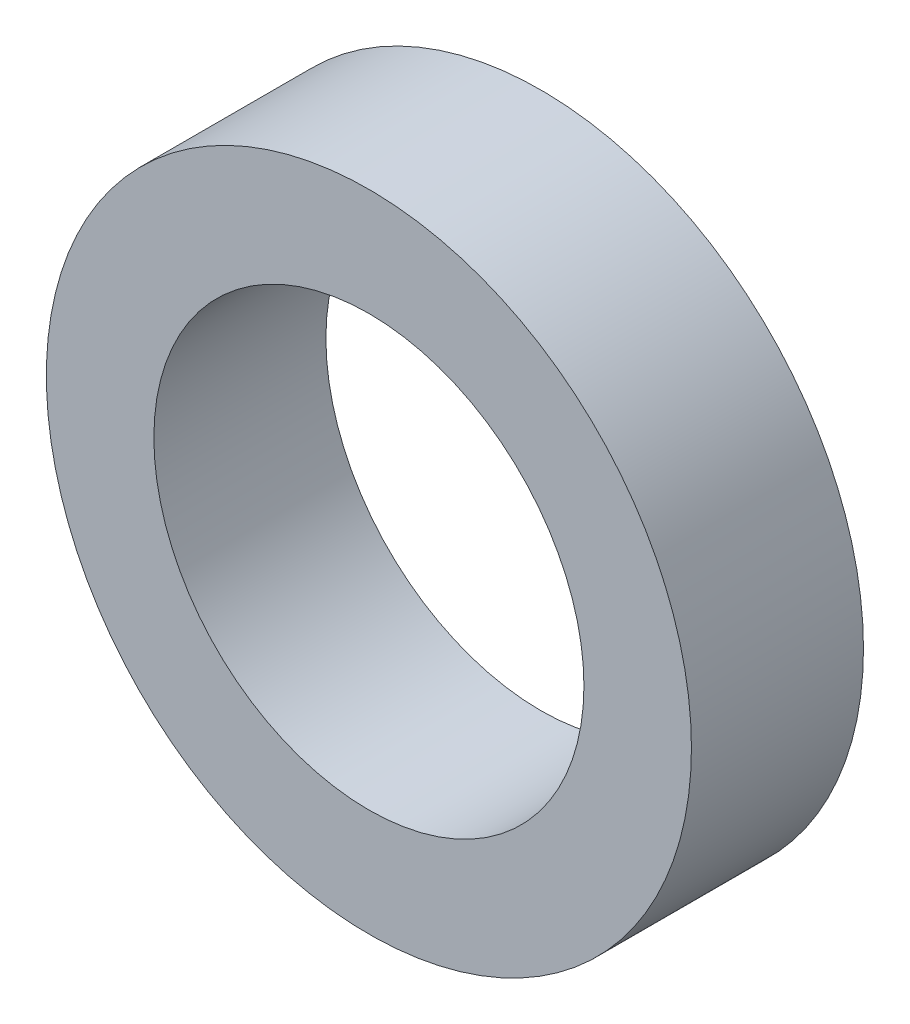
ISO-10303-21;
HEADER;
FILE_DESCRIPTION(('STEP AP214'),'2;1');
FILE_NAME('part.step','',(''),(''),'','','');
FILE_SCHEMA(('AUTOMOTIVE_DESIGN { 1 0 10303 214 1 1 1 1 }'));
ENDSEC;
DATA;
#1=APPLICATION_CONTEXT('core data for automotive mechanical design processes');
#2=APPLICATION_PROTOCOL_DEFINITION('international standard','automotive_design',2000,#1);
#3=PRODUCT_CONTEXT('',#1,'mechanical');
#4=PRODUCT('Part','Part','',(#3));
#5=PRODUCT_RELATED_PRODUCT_CATEGORY('part','',(#4));
#6=PRODUCT_DEFINITION_FORMATION('','',#4);
#7=PRODUCT_DEFINITION_CONTEXT('part definition',#1,'design');
#8=PRODUCT_DEFINITION('design','',#6,#7);
#9=PRODUCT_DEFINITION_SHAPE('','',#8);
#10=(LENGTH_UNIT() NAMED_UNIT(*) SI_UNIT(.MILLI.,.METRE.));
#11=(NAMED_UNIT(*) PLANE_ANGLE_UNIT() SI_UNIT($,.RADIAN.));
#12=(NAMED_UNIT(*) SI_UNIT($,.STERADIAN.) SOLID_ANGLE_UNIT());
#13=UNCERTAINTY_MEASURE_WITH_UNIT(LENGTH_MEASURE(1.E-05),#10,'distance_accuracy_value','');
#14=(GEOMETRIC_REPRESENTATION_CONTEXT(3) GLOBAL_UNCERTAINTY_ASSIGNED_CONTEXT((#13)) GLOBAL_UNIT_ASSIGNED_CONTEXT((#10,
#11,#12)) REPRESENTATION_CONTEXT('',''));
#15=CARTESIAN_POINT('',(0.,0.,0.));
#16=DIRECTION('',(0.,0.,1.));
#17=DIRECTION('',(1.,0.,0.));
#18=AXIS2_PLACEMENT_3D('',#15,#16,#17);
#19=CARTESIAN_POINT('',(0.,7.5,-2.));
#20=DIRECTION('',(0.,0.,1.));
#21=DIRECTION('',(1.,0.,0.));
#22=AXIS2_PLACEMENT_3D('',#19,#20,#21);
#23=PLANE('',#22);
#24=CARTESIAN_POINT('',(0.,0.,-2.));
#25=DIRECTION('',(0.,0.,1.));
#26=DIRECTION('',(1.,0.,0.));
#27=AXIS2_PLACEMENT_3D('',#24,#25,#26);
#28=CIRCLE('',#27,7.5);
#29=CARTESIAN_POINT('',(7.5,0.,-2.));
#30=VERTEX_POINT('',#29);
#31=EDGE_CURVE('E10',#30,#30,#28,.T.);
#32=ORIENTED_EDGE('',*,*,#31,.F.);
#33=EDGE_LOOP('',(#32));
#34=FACE_BOUND('',#33,.T.);
#35=CARTESIAN_POINT('',(0.,0.,-2.));
#36=DIRECTION('',(0.,0.,1.));
#37=DIRECTION('',(1.,0.,0.));
#38=AXIS2_PLACEMENT_3D('',#35,#36,#37);
#39=CIRCLE('',#38,5.);
#40=CARTESIAN_POINT('',(5.,0.,-2.));
#41=VERTEX_POINT('',#40);
#42=EDGE_CURVE('E44',#41,#41,#39,.T.);
#43=ORIENTED_EDGE('',*,*,#42,.T.);
#44=EDGE_LOOP('',(#43));
#45=FACE_BOUND('',#44,.T.);
#46=ADVANCED_FACE('F30',(#34,#45),#23,.F.);
#47=CARTESIAN_POINT('',(0.,0.,12.9347826086957));
#48=DIRECTION('',(0.,0.,1.));
#49=DIRECTION('',(1.,0.,0.));
#50=AXIS2_PLACEMENT_3D('',#47,#48,#49);
#51=CYLINDRICAL_SURFACE('',#50,7.5);
#52=CARTESIAN_POINT('',(0.,0.,2.));
#53=DIRECTION('',(0.,0.,1.));
#54=DIRECTION('',(1.,0.,0.));
#55=AXIS2_PLACEMENT_3D('',#52,#53,#54);
#56=CIRCLE('',#55,7.5);
#57=CARTESIAN_POINT('',(7.5,0.,2.));
#58=VERTEX_POINT('',#57);
#59=EDGE_CURVE('E36',#58,#58,#56,.T.);
#60=ORIENTED_EDGE('',*,*,#59,.F.);
#61=EDGE_LOOP('',(#60));
#62=FACE_BOUND('',#61,.T.);
#63=ORIENTED_EDGE('',*,*,#31,.T.);
#64=EDGE_LOOP('',(#63));
#65=FACE_BOUND('',#64,.T.);
#66=ADVANCED_FACE('F59',(#62,#65),#51,.T.);
#67=CARTESIAN_POINT('',(0.,7.5,2.));
#68=DIRECTION('',(0.,0.,-1.));
#69=DIRECTION('',(-1.,0.,0.));
#70=AXIS2_PLACEMENT_3D('',#67,#68,#69);
#71=PLANE('',#70);
#72=CARTESIAN_POINT('',(0.,0.,2.));
#73=DIRECTION('',(0.,0.,1.));
#74=DIRECTION('',(1.,0.,0.));
#75=AXIS2_PLACEMENT_3D('',#72,#73,#74);
#76=CIRCLE('',#75,5.);
#77=CARTESIAN_POINT('',(5.,0.,2.));
#78=VERTEX_POINT('',#77);
#79=EDGE_CURVE('E40',#78,#78,#76,.T.);
#80=ORIENTED_EDGE('',*,*,#79,.F.);
#81=EDGE_LOOP('',(#80));
#82=FACE_BOUND('',#81,.T.);
#83=ORIENTED_EDGE('',*,*,#59,.T.);
#84=EDGE_LOOP('',(#83));
#85=FACE_BOUND('',#84,.T.);
#86=ADVANCED_FACE('F54',(#82,#85),#71,.F.);
#87=CARTESIAN_POINT('',(0.,0.,12.9347826086957));
#88=DIRECTION('',(0.,0.,1.));
#89=DIRECTION('',(1.,0.,0.));
#90=AXIS2_PLACEMENT_3D('',#87,#88,#89);
#91=CYLINDRICAL_SURFACE('',#90,5.);
#92=ORIENTED_EDGE('',*,*,#42,.F.);
#93=EDGE_LOOP('',(#92));
#94=FACE_BOUND('',#93,.T.);
#95=ORIENTED_EDGE('',*,*,#79,.T.);
#96=EDGE_LOOP('',(#95));
#97=FACE_BOUND('',#96,.T.);
#98=ADVANCED_FACE('F51',(#94,#97),#91,.F.);
#99=CLOSED_SHELL('',(#46,#66,#86,#98));
#100=MANIFOLD_SOLID_BREP('B2',#99);
#101=ADVANCED_BREP_SHAPE_REPRESENTATION('',(#18,#100),#14);
#102=SHAPE_DEFINITION_REPRESENTATION(#9,#101);
ENDSEC;
END-ISO-10303-21;
